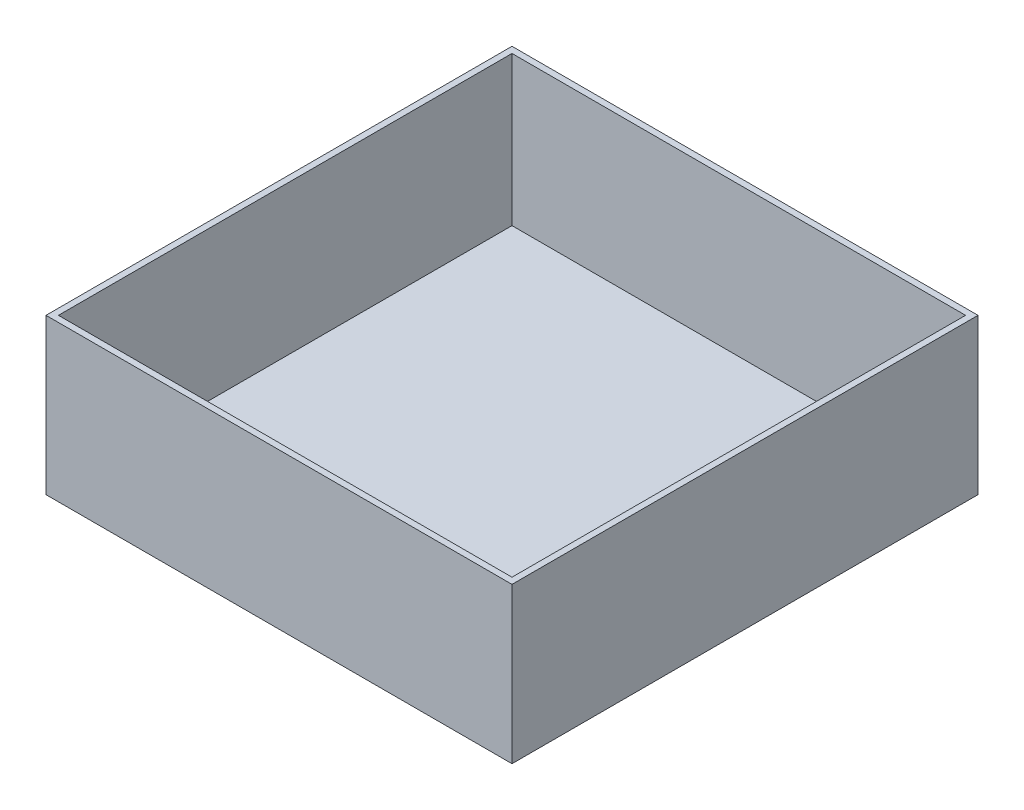
ISO-10303-21;
HEADER;
FILE_DESCRIPTION(('STEP AP214'),'2;1');
FILE_NAME('part.step','',(''),(''),'','','');
FILE_SCHEMA(('AUTOMOTIVE_DESIGN { 1 0 10303 214 1 1 1 1 }'));
ENDSEC;
DATA;
#1=APPLICATION_CONTEXT('core data for automotive mechanical design processes');
#2=APPLICATION_PROTOCOL_DEFINITION('international standard','automotive_design',2000,#1);
#3=PRODUCT_CONTEXT('',#1,'mechanical');
#4=PRODUCT('Part','Part','',(#3));
#5=PRODUCT_RELATED_PRODUCT_CATEGORY('part','',(#4));
#6=PRODUCT_DEFINITION_FORMATION('','',#4);
#7=PRODUCT_DEFINITION_CONTEXT('part definition',#1,'design');
#8=PRODUCT_DEFINITION('design','',#6,#7);
#9=PRODUCT_DEFINITION_SHAPE('','',#8);
#10=(LENGTH_UNIT() NAMED_UNIT(*) SI_UNIT(.MILLI.,.METRE.));
#11=(NAMED_UNIT(*) PLANE_ANGLE_UNIT() SI_UNIT($,.RADIAN.));
#12=(NAMED_UNIT(*) SI_UNIT($,.STERADIAN.) SOLID_ANGLE_UNIT());
#13=UNCERTAINTY_MEASURE_WITH_UNIT(LENGTH_MEASURE(1.E-05),#10,'distance_accuracy_value','');
#14=(GEOMETRIC_REPRESENTATION_CONTEXT(3) GLOBAL_UNCERTAINTY_ASSIGNED_CONTEXT((#13)) GLOBAL_UNIT_ASSIGNED_CONTEXT((#10,
#11,#12)) REPRESENTATION_CONTEXT('',''));
#15=CARTESIAN_POINT('',(0.,0.,0.));
#16=DIRECTION('',(0.,0.,1.));
#17=DIRECTION('',(1.,0.,0.));
#18=AXIS2_PLACEMENT_3D('',#15,#16,#17);
#19=CARTESIAN_POINT('',(-150.,50.,300.3));
#20=DIRECTION('',(0.,-1.,0.));
#21=DIRECTION('',(0.,0.,-1.));
#22=AXIS2_PLACEMENT_3D('',#19,#20,#21);
#23=PLANE('',#22);
#24=DIRECTION('',(-1.,0.,0.));
#25=VECTOR('',#24,1.);
#26=CARTESIAN_POINT('',(-150.,50.,0.3));
#27=LINE('',#26,#25);
#28=CARTESIAN_POINT('',(150.,50.,0.3));
#29=VERTEX_POINT('',#28);
#30=CARTESIAN_POINT('',(-150.,50.,0.3));
#31=VERTEX_POINT('',#30);
#32=EDGE_CURVE('E285',#29,#31,#27,.T.);
#33=ORIENTED_EDGE('',*,*,#32,.T.);
#34=DIRECTION('',(0.,0.,-1.));
#35=VECTOR('',#34,1.);
#36=CARTESIAN_POINT('',(-150.,50.,300.3));
#37=LINE('',#36,#35);
#38=CARTESIAN_POINT('',(-150.,50.,300.3));
#39=VERTEX_POINT('',#38);
#40=EDGE_CURVE('E295',#39,#31,#37,.T.);
#41=ORIENTED_EDGE('',*,*,#40,.F.);
#42=DIRECTION('',(-1.,0.,0.));
#43=VECTOR('',#42,1.);
#44=CARTESIAN_POINT('',(-150.,50.,300.3));
#45=LINE('',#44,#43);
#46=CARTESIAN_POINT('',(150.,50.,300.3));
#47=VERTEX_POINT('',#46);
#48=EDGE_CURVE('E275',#47,#39,#45,.T.);
#49=ORIENTED_EDGE('',*,*,#48,.F.);
#50=DIRECTION('',(0.,0.,-1.));
#51=VECTOR('',#50,1.);
#52=CARTESIAN_POINT('',(150.,50.,300.3));
#53=LINE('',#52,#51);
#54=EDGE_CURVE('E298',#47,#29,#53,.T.);
#55=ORIENTED_EDGE('',*,*,#54,.T.);
#56=EDGE_LOOP('',(#33,#41,#49,#55));
#57=FACE_BOUND('',#56,.T.);
#58=DIRECTION('',(-1.,0.,0.));
#59=VECTOR('',#58,1.);
#60=CARTESIAN_POINT('',(-150.,50.,4.30000000000003));
#61=LINE('',#60,#59);
#62=CARTESIAN_POINT('',(146.,50.,4.3));
#63=VERTEX_POINT('',#62);
#64=CARTESIAN_POINT('',(-146.,50.,4.3));
#65=VERTEX_POINT('',#64);
#66=EDGE_CURVE('E240',#63,#65,#61,.T.);
#67=ORIENTED_EDGE('',*,*,#66,.F.);
#68=DIRECTION('',(0.,0.,-1.));
#69=VECTOR('',#68,1.);
#70=CARTESIAN_POINT('',(146.,50.,300.3));
#71=LINE('',#70,#69);
#72=CARTESIAN_POINT('',(146.,50.,296.3));
#73=VERTEX_POINT('',#72);
#74=EDGE_CURVE('E265',#73,#63,#71,.T.);
#75=ORIENTED_EDGE('',*,*,#74,.F.);
#76=DIRECTION('',(-1.,0.,0.));
#77=VECTOR('',#76,1.);
#78=CARTESIAN_POINT('',(-150.,50.,296.3));
#79=LINE('',#78,#77);
#80=CARTESIAN_POINT('',(-146.,50.,296.3));
#81=VERTEX_POINT('',#80);
#82=EDGE_CURVE('E246',#73,#81,#79,.T.);
#83=ORIENTED_EDGE('',*,*,#82,.T.);
#84=DIRECTION('',(0.,0.,-1.));
#85=VECTOR('',#84,1.);
#86=CARTESIAN_POINT('',(-146.,50.,300.3));
#87=LINE('',#86,#85);
#88=EDGE_CURVE('E256',#81,#65,#87,.T.);
#89=ORIENTED_EDGE('',*,*,#88,.T.);
#90=EDGE_LOOP('',(#67,#75,#83,#89));
#91=FACE_BOUND('',#90,.T.);
#92=ADVANCED_FACE('F39',(#57,#91),#23,.F.);
#93=CARTESIAN_POINT('',(0.,-10.,-10.));
#94=DIRECTION('',(0.,1.,0.));
#95=DIRECTION('',(0.,0.,1.));
#96=AXIS2_PLACEMENT_3D('',#93,#94,#95);
#97=CYLINDRICAL_SURFACE('',#96,5.);
#98=DIRECTION('',(0.,1.,0.));
#99=VECTOR('',#98,1.);
#100=CARTESIAN_POINT('',(-5.,-10.,-10.));
#101=LINE('',#100,#99);
#102=CARTESIAN_POINT('',(-5.,-10.,-10.));
#103=VERTEX_POINT('',#102);
#104=CARTESIAN_POINT('',(-5.,-2.5,-10.));
#105=VERTEX_POINT('',#104);
#106=EDGE_CURVE('E364',#103,#105,#101,.T.);
#107=ORIENTED_EDGE('',*,*,#106,.T.);
#108=CARTESIAN_POINT('',(0.,-2.5,-10.));
#109=DIRECTION('',(0.,1.,0.));
#110=DIRECTION('',(0.,0.,1.));
#111=AXIS2_PLACEMENT_3D('',#108,#109,#110);
#112=CIRCLE('',#111,5.);
#113=CARTESIAN_POINT('',(5.,-2.5,-10.));
#114=VERTEX_POINT('',#113);
#115=EDGE_CURVE('E63',#105,#114,#112,.F.);
#116=ORIENTED_EDGE('',*,*,#115,.T.);
#117=DIRECTION('',(0.,1.,0.));
#118=VECTOR('',#117,1.);
#119=CARTESIAN_POINT('',(5.,-10.,-10.));
#120=LINE('',#119,#118);
#121=CARTESIAN_POINT('',(5.,-10.,-10.));
#122=VERTEX_POINT('',#121);
#123=EDGE_CURVE('E353',#122,#114,#120,.T.);
#124=ORIENTED_EDGE('',*,*,#123,.F.);
#125=CARTESIAN_POINT('',(0.,-10.,-10.));
#126=DIRECTION('',(0.,1.,0.));
#127=DIRECTION('',(0.,0.,1.));
#128=AXIS2_PLACEMENT_3D('',#125,#126,#127);
#129=CIRCLE('',#128,5.);
#130=EDGE_CURVE('E340',#122,#103,#129,.T.);
#131=ORIENTED_EDGE('',*,*,#130,.T.);
#132=EDGE_LOOP('',(#107,#116,#124,#131));
#133=FACE_BOUND('',#132,.T.);
#134=ADVANCED_FACE('F419',(#133),#97,.T.);
#135=CARTESIAN_POINT('',(0.,-10.,-10.));
#136=DIRECTION('',(0.,1.,0.));
#137=DIRECTION('',(0.,0.,1.));
#138=AXIS2_PLACEMENT_3D('',#135,#136,#137);
#139=CYLINDRICAL_SURFACE('',#138,2.5);
#140=CARTESIAN_POINT('',(0.,-10.,-10.));
#141=DIRECTION('',(0.,1.,0.));
#142=DIRECTION('',(0.,0.,1.));
#143=AXIS2_PLACEMENT_3D('',#140,#141,#142);
#144=CIRCLE('',#143,2.5);
#145=CARTESIAN_POINT('',(0.,-10.,-7.5));
#146=VERTEX_POINT('',#145);
#147=EDGE_CURVE('E337',#146,#146,#144,.T.);
#148=ORIENTED_EDGE('',*,*,#147,.F.);
#149=EDGE_LOOP('',(#148));
#150=FACE_BOUND('',#149,.T.);
#151=CARTESIAN_POINT('',(0.,-2.5,-10.));
#152=DIRECTION('',(0.,1.,0.));
#153=DIRECTION('',(0.,0.,1.));
#154=AXIS2_PLACEMENT_3D('',#151,#152,#153);
#155=CIRCLE('',#154,2.5);
#156=CARTESIAN_POINT('',(0.,-2.5,-7.5));
#157=VERTEX_POINT('',#156);
#158=EDGE_CURVE('E307',#157,#157,#155,.F.);
#159=ORIENTED_EDGE('',*,*,#158,.F.);
#160=EDGE_LOOP('',(#159));
#161=FACE_BOUND('',#160,.T.);
#162=ADVANCED_FACE('F425',(#150,#161),#139,.F.);
#163=CARTESIAN_POINT('',(0.,0.,0.));
#164=DIRECTION('',(0.,0.,1.));
#165=DIRECTION('',(1.,0.,0.));
#166=AXIS2_PLACEMENT_3D('',#163,#164,#165);
#167=PLANE('',#166);
#168=DIRECTION('',(0.,-1.,0.));
#169=VECTOR('',#168,1.);
#170=CARTESIAN_POINT('',(-20.,20.,0.));
#171=LINE('',#170,#169);
#172=CARTESIAN_POINT('',(-20.,20.,0.));
#173=VERTEX_POINT('',#172);
#174=CARTESIAN_POINT('',(-20.,-20.,0.));
#175=VERTEX_POINT('',#174);
#176=EDGE_CURVE('E356',#173,#175,#171,.T.);
#177=ORIENTED_EDGE('',*,*,#176,.F.);
#178=DIRECTION('',(1.,0.,0.));
#179=VECTOR('',#178,1.);
#180=CARTESIAN_POINT('',(-20.,20.,0.));
#181=LINE('',#180,#179);
#182=CARTESIAN_POINT('',(20.,20.,0.));
#183=VERTEX_POINT('',#182);
#184=EDGE_CURVE('E370',#173,#183,#181,.T.);
#185=ORIENTED_EDGE('',*,*,#184,.T.);
#186=DIRECTION('',(0.,-1.,0.));
#187=VECTOR('',#186,1.);
#188=CARTESIAN_POINT('',(20.,20.,0.));
#189=LINE('',#188,#187);
#190=CARTESIAN_POINT('',(20.,-20.,0.));
#191=VERTEX_POINT('',#190);
#192=EDGE_CURVE('E384',#183,#191,#189,.T.);
#193=ORIENTED_EDGE('',*,*,#192,.T.);
#194=DIRECTION('',(1.,0.,0.));
#195=VECTOR('',#194,1.);
#196=CARTESIAN_POINT('',(-20.,-20.,0.));
#197=LINE('',#196,#195);
#198=EDGE_CURVE('E381',#175,#191,#197,.T.);
#199=ORIENTED_EDGE('',*,*,#198,.F.);
#200=EDGE_LOOP('',(#177,#185,#193,#199));
#201=FACE_BOUND('',#200,.T.);
#202=DIRECTION('',(1.,0.,0.));
#203=VECTOR('',#202,1.);
#204=CARTESIAN_POINT('',(-5.,-10.,0.));
#205=LINE('',#204,#203);
#206=CARTESIAN_POINT('',(-5.,-10.,0.));
#207=VERTEX_POINT('',#206);
#208=CARTESIAN_POINT('',(5.,-10.,0.));
#209=VERTEX_POINT('',#208);
#210=EDGE_CURVE('E346',#207,#209,#205,.T.);
#211=ORIENTED_EDGE('',*,*,#210,.T.);
#212=DIRECTION('',(0.,1.,0.));
#213=VECTOR('',#212,1.);
#214=CARTESIAN_POINT('',(5.,-10.,0.));
#215=LINE('',#214,#213);
#216=CARTESIAN_POINT('',(5.,10.,0.));
#217=VERTEX_POINT('',#216);
#218=EDGE_CURVE('E358',#209,#217,#215,.T.);
#219=ORIENTED_EDGE('',*,*,#218,.T.);
#220=DIRECTION('',(1.,0.,0.));
#221=VECTOR('',#220,1.);
#222=CARTESIAN_POINT('',(-5.,10.,0.));
#223=LINE('',#222,#221);
#224=CARTESIAN_POINT('',(-5.,10.,0.));
#225=VERTEX_POINT('',#224);
#226=EDGE_CURVE('E332',#225,#217,#223,.T.);
#227=ORIENTED_EDGE('',*,*,#226,.F.);
#228=DIRECTION('',(0.,1.,0.));
#229=VECTOR('',#228,1.);
#230=CARTESIAN_POINT('',(-5.,-10.,0.));
#231=LINE('',#230,#229);
#232=EDGE_CURVE('E361',#207,#225,#231,.T.);
#233=ORIENTED_EDGE('',*,*,#232,.F.);
#234=EDGE_LOOP('',(#211,#219,#227,#233));
#235=FACE_BOUND('',#234,.T.);
#236=ADVANCED_FACE('F638',(#201,#235),#167,.F.);
#237=CARTESIAN_POINT('',(-20.,20.,0.3));
#238=DIRECTION('',(1.,0.,0.));
#239=DIRECTION('',(0.,1.,0.));
#240=AXIS2_PLACEMENT_3D('',#237,#238,#239);
#241=PLANE('',#240);
#242=ORIENTED_EDGE('',*,*,#176,.T.);
#243=DIRECTION('',(0.,0.,-1.));
#244=VECTOR('',#243,1.);
#245=CARTESIAN_POINT('',(-20.,-20.,0.3));
#246=LINE('',#245,#244);
#247=CARTESIAN_POINT('',(-20.,-20.,0.3));
#248=VERTEX_POINT('',#247);
#249=EDGE_CURVE('E48',#248,#175,#246,.T.);
#250=ORIENTED_EDGE('',*,*,#249,.F.);
#251=DIRECTION('',(0.,-1.,0.));
#252=VECTOR('',#251,1.);
#253=CARTESIAN_POINT('',(-20.,20.,0.3));
#254=LINE('',#253,#252);
#255=CARTESIAN_POINT('',(-20.,20.,0.3));
#256=VERTEX_POINT('',#255);
#257=EDGE_CURVE('E367',#256,#248,#254,.T.);
#258=ORIENTED_EDGE('',*,*,#257,.F.);
#259=DIRECTION('',(0.,0.,-1.));
#260=VECTOR('',#259,1.);
#261=CARTESIAN_POINT('',(-20.,20.,0.3));
#262=LINE('',#261,#260);
#263=EDGE_CURVE('E378',#256,#173,#262,.T.);
#264=ORIENTED_EDGE('',*,*,#263,.T.);
#265=EDGE_LOOP('',(#242,#250,#258,#264));
#266=FACE_BOUND('',#265,.T.);
#267=ADVANCED_FACE('F41',(#266),#241,.F.);
#268=CARTESIAN_POINT('',(-20.,-20.,0.3));
#269=DIRECTION('',(0.,1.,0.));
#270=DIRECTION('',(0.,0.,1.));
#271=AXIS2_PLACEMENT_3D('',#268,#269,#270);
#272=PLANE('',#271);
#273=ORIENTED_EDGE('',*,*,#198,.T.);
#274=DIRECTION('',(0.,0.,-1.));
#275=VECTOR('',#274,1.);
#276=CARTESIAN_POINT('',(20.,-20.,0.3));
#277=LINE('',#276,#275);
#278=CARTESIAN_POINT('',(20.,-20.,0.3));
#279=VERTEX_POINT('',#278);
#280=EDGE_CURVE('E392',#279,#191,#277,.T.);
#281=ORIENTED_EDGE('',*,*,#280,.F.);
#282=DIRECTION('',(1.,0.,0.));
#283=VECTOR('',#282,1.);
#284=CARTESIAN_POINT('',(-20.,-20.,0.3));
#285=LINE('',#284,#283);
#286=EDGE_CURVE('E369',#248,#279,#285,.T.);
#287=ORIENTED_EDGE('',*,*,#286,.F.);
#288=ORIENTED_EDGE('',*,*,#249,.T.);
#289=EDGE_LOOP('',(#273,#281,#287,#288));
#290=FACE_BOUND('',#289,.T.);
#291=ADVANCED_FACE('F620',(#290),#272,.F.);
#292=CARTESIAN_POINT('',(20.,20.,0.3));
#293=DIRECTION('',(1.,0.,0.));
#294=DIRECTION('',(0.,1.,0.));
#295=AXIS2_PLACEMENT_3D('',#292,#293,#294);
#296=PLANE('',#295);
#297=ORIENTED_EDGE('',*,*,#192,.F.);
#298=DIRECTION('',(0.,0.,-1.));
#299=VECTOR('',#298,1.);
#300=CARTESIAN_POINT('',(20.,20.,0.3));
#301=LINE('',#300,#299);
#302=CARTESIAN_POINT('',(20.,20.,0.3));
#303=VERTEX_POINT('',#302);
#304=EDGE_CURVE('E390',#303,#183,#301,.T.);
#305=ORIENTED_EDGE('',*,*,#304,.F.);
#306=DIRECTION('',(0.,-1.,0.));
#307=VECTOR('',#306,1.);
#308=CARTESIAN_POINT('',(20.,20.,0.3));
#309=LINE('',#308,#307);
#310=EDGE_CURVE('E372',#303,#279,#309,.T.);
#311=ORIENTED_EDGE('',*,*,#310,.T.);
#312=ORIENTED_EDGE('',*,*,#280,.T.);
#313=EDGE_LOOP('',(#297,#305,#311,#312));
#314=FACE_BOUND('',#313,.T.);
#315=ADVANCED_FACE('F608',(#314),#296,.T.);
#316=CARTESIAN_POINT('',(-20.,20.,0.3));
#317=DIRECTION('',(0.,1.,0.));
#318=DIRECTION('',(0.,0.,1.));
#319=AXIS2_PLACEMENT_3D('',#316,#317,#318);
#320=PLANE('',#319);
#321=ORIENTED_EDGE('',*,*,#184,.F.);
#322=ORIENTED_EDGE('',*,*,#263,.F.);
#323=DIRECTION('',(1.,0.,0.));
#324=VECTOR('',#323,1.);
#325=CARTESIAN_POINT('',(-20.,20.,0.3));
#326=LINE('',#325,#324);
#327=EDGE_CURVE('E375',#256,#303,#326,.T.);
#328=ORIENTED_EDGE('',*,*,#327,.T.);
#329=ORIENTED_EDGE('',*,*,#304,.T.);
#330=EDGE_LOOP('',(#321,#322,#328,#329));
#331=FACE_BOUND('',#330,.T.);
#332=ADVANCED_FACE('F603',(#331),#320,.T.);
#333=CARTESIAN_POINT('',(0.,2.5,-10.));
#334=DIRECTION('',(0.,1.,0.));
#335=DIRECTION('',(0.,0.,1.));
#336=AXIS2_PLACEMENT_3D('',#333,#334,#335);
#337=CIRCLE('',#336,5.);
#338=CARTESIAN_POINT('',(-5.,2.5,-10.));
#339=VERTEX_POINT('',#338);
#340=CARTESIAN_POINT('',(5.,2.5,-10.));
#341=VERTEX_POINT('',#340);
#342=EDGE_CURVE('E317',#339,#341,#337,.F.);
#343=ORIENTED_EDGE('',*,*,#342,.F.);
#344=CARTESIAN_POINT('',(-5.,10.,-10.));
#345=VERTEX_POINT('',#344);
#346=EDGE_CURVE('E352',#339,#345,#101,.T.);
#347=ORIENTED_EDGE('',*,*,#346,.T.);
#348=CARTESIAN_POINT('',(0.,10.,-10.));
#349=DIRECTION('',(0.,1.,0.));
#350=DIRECTION('',(0.,0.,1.));
#351=AXIS2_PLACEMENT_3D('',#348,#349,#350);
#352=CIRCLE('',#351,5.);
#353=CARTESIAN_POINT('',(5.,10.,-10.));
#354=VERTEX_POINT('',#353);
#355=EDGE_CURVE('E327',#354,#345,#352,.T.);
#356=ORIENTED_EDGE('',*,*,#355,.F.);
#357=EDGE_CURVE('E357',#341,#354,#120,.T.);
#358=ORIENTED_EDGE('',*,*,#357,.F.);
#359=EDGE_LOOP('',(#343,#347,#356,#358));
#360=FACE_BOUND('',#359,.T.);
#361=ADVANCED_FACE('F428',(#360),#97,.T.);
#362=CARTESIAN_POINT('',(5.,-10.,-10.));
#363=DIRECTION('',(1.,0.,0.));
#364=DIRECTION('',(0.,0.,-1.));
#365=AXIS2_PLACEMENT_3D('',#362,#363,#364);
#366=PLANE('',#365);
#367=DIRECTION('',(0.,0.,1.));
#368=VECTOR('',#367,1.);
#369=CARTESIAN_POINT('',(5.,2.5,-10.));
#370=LINE('',#369,#368);
#371=CARTESIAN_POINT('',(5.,2.5,-4.));
#372=VERTEX_POINT('',#371);
#373=EDGE_CURVE('E319',#341,#372,#370,.T.);
#374=ORIENTED_EDGE('',*,*,#373,.F.);
#375=ORIENTED_EDGE('',*,*,#357,.T.);
#376=DIRECTION('',(0.,0.,-1.));
#377=VECTOR('',#376,1.);
#378=CARTESIAN_POINT('',(5.,10.,-10.));
#379=LINE('',#378,#377);
#380=EDGE_CURVE('E334',#217,#354,#379,.T.);
#381=ORIENTED_EDGE('',*,*,#380,.F.);
#382=ORIENTED_EDGE('',*,*,#218,.F.);
#383=DIRECTION('',(0.,0.,-1.));
#384=VECTOR('',#383,1.);
#385=CARTESIAN_POINT('',(5.,-10.,-10.));
#386=LINE('',#385,#384);
#387=EDGE_CURVE('E349',#209,#122,#386,.T.);
#388=ORIENTED_EDGE('',*,*,#387,.T.);
#389=ORIENTED_EDGE('',*,*,#123,.T.);
#390=DIRECTION('',(0.,0.,1.));
#391=VECTOR('',#390,1.);
#392=CARTESIAN_POINT('',(5.,-2.5,-10.));
#393=LINE('',#392,#391);
#394=CARTESIAN_POINT('',(5.,-2.5,-4.));
#395=VERTEX_POINT('',#394);
#396=EDGE_CURVE('E311',#114,#395,#393,.T.);
#397=ORIENTED_EDGE('',*,*,#396,.T.);
#398=DIRECTION('',(0.,1.,0.));
#399=VECTOR('',#398,1.);
#400=CARTESIAN_POINT('',(5.,-10.,-4.));
#401=LINE('',#400,#399);
#402=EDGE_CURVE('E321',#395,#372,#401,.T.);
#403=ORIENTED_EDGE('',*,*,#402,.T.);
#404=EDGE_LOOP('',(#374,#375,#381,#382,#388,#389,#397,#403));
#405=FACE_BOUND('',#404,.T.);
#406=ADVANCED_FACE('F678',(#405),#366,.T.);
#407=CARTESIAN_POINT('',(-5.,-10.,-10.));
#408=DIRECTION('',(-1.,0.,0.));
#409=DIRECTION('',(0.,0.,1.));
#410=AXIS2_PLACEMENT_3D('',#407,#408,#409);
#411=PLANE('',#410);
#412=DIRECTION('',(0.,0.,-1.));
#413=VECTOR('',#412,1.);
#414=CARTESIAN_POINT('',(-5.,2.5,-10.));
#415=LINE('',#414,#413);
#416=CARTESIAN_POINT('',(-5.,2.5,-4.));
#417=VERTEX_POINT('',#416);
#418=EDGE_CURVE('E315',#417,#339,#415,.T.);
#419=ORIENTED_EDGE('',*,*,#418,.F.);
#420=DIRECTION('',(0.,-1.,0.));
#421=VECTOR('',#420,1.);
#422=CARTESIAN_POINT('',(-5.,-10.,-4.));
#423=LINE('',#422,#421);
#424=CARTESIAN_POINT('',(-5.,-2.5,-4.));
#425=VERTEX_POINT('',#424);
#426=EDGE_CURVE('E11',#417,#425,#423,.T.);
#427=ORIENTED_EDGE('',*,*,#426,.T.);
#428=DIRECTION('',(0.,0.,-1.));
#429=VECTOR('',#428,1.);
#430=CARTESIAN_POINT('',(-5.,-2.5,-10.));
#431=LINE('',#430,#429);
#432=EDGE_CURVE('E308',#425,#105,#431,.T.);
#433=ORIENTED_EDGE('',*,*,#432,.T.);
#434=ORIENTED_EDGE('',*,*,#106,.F.);
#435=DIRECTION('',(0.,0.,1.));
#436=VECTOR('',#435,1.);
#437=CARTESIAN_POINT('',(-5.,-10.,-10.));
#438=LINE('',#437,#436);
#439=EDGE_CURVE('E343',#103,#207,#438,.T.);
#440=ORIENTED_EDGE('',*,*,#439,.T.);
#441=ORIENTED_EDGE('',*,*,#232,.T.);
#442=DIRECTION('',(0.,0.,1.));
#443=VECTOR('',#442,1.);
#444=CARTESIAN_POINT('',(-5.,10.,-10.));
#445=LINE('',#444,#443);
#446=EDGE_CURVE('E330',#345,#225,#445,.T.);
#447=ORIENTED_EDGE('',*,*,#446,.F.);
#448=ORIENTED_EDGE('',*,*,#346,.F.);
#449=EDGE_LOOP('',(#419,#427,#433,#434,#440,#441,#447,#448));
#450=FACE_BOUND('',#449,.T.);
#451=ADVANCED_FACE('F673',(#450),#411,.T.);
#452=CARTESIAN_POINT('',(0.,-10.,-10.));
#453=DIRECTION('',(0.,1.,0.));
#454=DIRECTION('',(0.,0.,1.));
#455=AXIS2_PLACEMENT_3D('',#452,#453,#454);
#456=PLANE('',#455);
#457=ORIENTED_EDGE('',*,*,#147,.T.);
#458=EDGE_LOOP('',(#457));
#459=FACE_BOUND('',#458,.T.);
#460=ORIENTED_EDGE('',*,*,#130,.F.);
#461=ORIENTED_EDGE('',*,*,#387,.F.);
#462=ORIENTED_EDGE('',*,*,#210,.F.);
#463=ORIENTED_EDGE('',*,*,#439,.F.);
#464=EDGE_LOOP('',(#460,#461,#462,#463));
#465=FACE_BOUND('',#464,.T.);
#466=ADVANCED_FACE('F665',(#459,#465),#456,.F.);
#467=CARTESIAN_POINT('',(0.,2.5,-10.));
#468=DIRECTION('',(0.,1.,0.));
#469=DIRECTION('',(0.,0.,1.));
#470=AXIS2_PLACEMENT_3D('',#467,#468,#469);
#471=CIRCLE('',#470,2.5);
#472=CARTESIAN_POINT('',(0.,2.5,-7.5));
#473=VERTEX_POINT('',#472);
#474=EDGE_CURVE('E314',#473,#473,#471,.F.);
#475=ORIENTED_EDGE('',*,*,#474,.T.);
#476=EDGE_LOOP('',(#475));
#477=FACE_BOUND('',#476,.T.);
#478=CARTESIAN_POINT('',(0.,10.,-10.));
#479=DIRECTION('',(0.,1.,0.));
#480=DIRECTION('',(0.,0.,1.));
#481=AXIS2_PLACEMENT_3D('',#478,#479,#480);
#482=CIRCLE('',#481,2.5);
#483=CARTESIAN_POINT('',(0.,10.,-7.5));
#484=VERTEX_POINT('',#483);
#485=EDGE_CURVE('E324',#484,#484,#482,.T.);
#486=ORIENTED_EDGE('',*,*,#485,.T.);
#487=EDGE_LOOP('',(#486));
#488=FACE_BOUND('',#487,.T.);
#489=ADVANCED_FACE('F400',(#477,#488),#139,.F.);
#490=CARTESIAN_POINT('',(0.,10.,-10.));
#491=DIRECTION('',(0.,1.,0.));
#492=DIRECTION('',(0.,0.,1.));
#493=AXIS2_PLACEMENT_3D('',#490,#491,#492);
#494=PLANE('',#493);
#495=ORIENTED_EDGE('',*,*,#355,.T.);
#496=ORIENTED_EDGE('',*,*,#446,.T.);
#497=ORIENTED_EDGE('',*,*,#226,.T.);
#498=ORIENTED_EDGE('',*,*,#380,.T.);
#499=EDGE_LOOP('',(#495,#496,#497,#498));
#500=FACE_BOUND('',#499,.T.);
#501=ORIENTED_EDGE('',*,*,#485,.F.);
#502=EDGE_LOOP('',(#501));
#503=FACE_BOUND('',#502,.T.);
#504=ADVANCED_FACE('F406',(#500,#503),#494,.T.);
#505=CARTESIAN_POINT('',(0.,2.5,0.));
#506=DIRECTION('',(0.,1.,0.));
#507=DIRECTION('',(0.,0.,1.));
#508=AXIS2_PLACEMENT_3D('',#505,#506,#507);
#509=PLANE('',#508);
#510=ORIENTED_EDGE('',*,*,#373,.T.);
#511=DIRECTION('',(1.,0.,0.));
#512=VECTOR('',#511,1.);
#513=CARTESIAN_POINT('',(-7.02807757222276,2.5,-4.));
#514=LINE('',#513,#512);
#515=EDGE_CURVE('E304',#417,#372,#514,.T.);
#516=ORIENTED_EDGE('',*,*,#515,.F.);
#517=ORIENTED_EDGE('',*,*,#418,.T.);
#518=ORIENTED_EDGE('',*,*,#342,.T.);
#519=EDGE_LOOP('',(#510,#516,#517,#518));
#520=FACE_BOUND('',#519,.T.);
#521=ORIENTED_EDGE('',*,*,#474,.F.);
#522=EDGE_LOOP('',(#521));
#523=FACE_BOUND('',#522,.T.);
#524=ADVANCED_FACE('F403',(#520,#523),#509,.F.);
#525=CARTESIAN_POINT('',(0.,-2.5,0.));
#526=DIRECTION('',(0.,1.,0.));
#527=DIRECTION('',(0.,0.,1.));
#528=AXIS2_PLACEMENT_3D('',#525,#526,#527);
#529=PLANE('',#528);
#530=ORIENTED_EDGE('',*,*,#115,.F.);
#531=ORIENTED_EDGE('',*,*,#432,.F.);
#532=DIRECTION('',(1.,0.,0.));
#533=VECTOR('',#532,1.);
#534=CARTESIAN_POINT('',(-7.02807757222276,-2.5,-4.));
#535=LINE('',#534,#533);
#536=EDGE_CURVE('E301',#425,#395,#535,.T.);
#537=ORIENTED_EDGE('',*,*,#536,.T.);
#538=ORIENTED_EDGE('',*,*,#396,.F.);
#539=EDGE_LOOP('',(#530,#531,#537,#538));
#540=FACE_BOUND('',#539,.T.);
#541=ORIENTED_EDGE('',*,*,#158,.T.);
#542=EDGE_LOOP('',(#541));
#543=FACE_BOUND('',#542,.T.);
#544=ADVANCED_FACE('F405',(#540,#543),#529,.T.);
#545=CARTESIAN_POINT('',(-7.02807757222276,2.5,-4.));
#546=DIRECTION('',(0.,0.,-1.));
#547=DIRECTION('',(-1.,0.,0.));
#548=AXIS2_PLACEMENT_3D('',#545,#546,#547);
#549=PLANE('',#548);
#550=ORIENTED_EDGE('',*,*,#536,.F.);
#551=ORIENTED_EDGE('',*,*,#426,.F.);
#552=ORIENTED_EDGE('',*,*,#515,.T.);
#553=ORIENTED_EDGE('',*,*,#402,.F.);
#554=EDGE_LOOP('',(#550,#551,#552,#553));
#555=FACE_BOUND('',#554,.T.);
#556=ADVANCED_FACE('F413',(#555),#549,.T.);
#557=CARTESIAN_POINT('',(0.,0.,0.3));
#558=DIRECTION('',(0.,0.,1.));
#559=DIRECTION('',(1.,0.,0.));
#560=AXIS2_PLACEMENT_3D('',#557,#558,#559);
#561=PLANE('',#560);
#562=DIRECTION('',(0.,1.,0.));
#563=VECTOR('',#562,1.);
#564=CARTESIAN_POINT('',(150.,50.,0.3));
#565=LINE('',#564,#563);
#566=CARTESIAN_POINT('',(150.,-50.,0.3));
#567=VERTEX_POINT('',#566);
#568=EDGE_CURVE('E271',#567,#29,#565,.T.);
#569=ORIENTED_EDGE('',*,*,#568,.F.);
#570=DIRECTION('',(1.,0.,0.));
#571=VECTOR('',#570,1.);
#572=CARTESIAN_POINT('',(-150.,-50.,0.3));
#573=LINE('',#572,#571);
#574=CARTESIAN_POINT('',(-150.,-50.,0.3));
#575=VERTEX_POINT('',#574);
#576=EDGE_CURVE('E276',#575,#567,#573,.T.);
#577=ORIENTED_EDGE('',*,*,#576,.F.);
#578=DIRECTION('',(0.,-1.,0.));
#579=VECTOR('',#578,1.);
#580=CARTESIAN_POINT('',(-150.,50.,0.3));
#581=LINE('',#580,#579);
#582=EDGE_CURVE('E287',#31,#575,#581,.T.);
#583=ORIENTED_EDGE('',*,*,#582,.F.);
#584=ORIENTED_EDGE('',*,*,#32,.F.);
#585=EDGE_LOOP('',(#569,#577,#583,#584));
#586=FACE_BOUND('',#585,.T.);
#587=ORIENTED_EDGE('',*,*,#327,.F.);
#588=ORIENTED_EDGE('',*,*,#257,.T.);
#589=ORIENTED_EDGE('',*,*,#286,.T.);
#590=ORIENTED_EDGE('',*,*,#310,.F.);
#591=EDGE_LOOP('',(#587,#588,#589,#590));
#592=FACE_BOUND('',#591,.T.);
#593=ADVANCED_FACE('F436',(#586,#592),#561,.F.);
#594=CARTESIAN_POINT('',(150.,50.,300.3));
#595=DIRECTION('',(-1.,0.,0.));
#596=DIRECTION('',(0.,0.,1.));
#597=AXIS2_PLACEMENT_3D('',#594,#595,#596);
#598=PLANE('',#597);
#599=ORIENTED_EDGE('',*,*,#568,.T.);
#600=ORIENTED_EDGE('',*,*,#54,.F.);
#601=DIRECTION('',(0.,1.,0.));
#602=VECTOR('',#601,1.);
#603=CARTESIAN_POINT('',(150.,50.,300.3));
#604=LINE('',#603,#602);
#605=CARTESIAN_POINT('',(150.,-50.,300.3));
#606=VERTEX_POINT('',#605);
#607=EDGE_CURVE('E272',#606,#47,#604,.T.);
#608=ORIENTED_EDGE('',*,*,#607,.F.);
#609=DIRECTION('',(0.,0.,-1.));
#610=VECTOR('',#609,1.);
#611=CARTESIAN_POINT('',(150.,-50.,300.3));
#612=LINE('',#611,#610);
#613=EDGE_CURVE('E282',#606,#567,#612,.T.);
#614=ORIENTED_EDGE('',*,*,#613,.T.);
#615=EDGE_LOOP('',(#599,#600,#608,#614));
#616=FACE_BOUND('',#615,.T.);
#617=ADVANCED_FACE('F434',(#616),#598,.F.);
#618=CARTESIAN_POINT('',(-150.,50.,300.3));
#619=DIRECTION('',(1.,0.,0.));
#620=DIRECTION('',(0.,0.,-1.));
#621=AXIS2_PLACEMENT_3D('',#618,#619,#620);
#622=PLANE('',#621);
#623=ORIENTED_EDGE('',*,*,#582,.T.);
#624=DIRECTION('',(0.,0.,-1.));
#625=VECTOR('',#624,1.);
#626=CARTESIAN_POINT('',(-150.,-50.,300.3));
#627=LINE('',#626,#625);
#628=CARTESIAN_POINT('',(-150.,-50.,300.3));
#629=VERTEX_POINT('',#628);
#630=EDGE_CURVE('E292',#629,#575,#627,.T.);
#631=ORIENTED_EDGE('',*,*,#630,.F.);
#632=DIRECTION('',(0.,-1.,0.));
#633=VECTOR('',#632,1.);
#634=CARTESIAN_POINT('',(-150.,50.,300.3));
#635=LINE('',#634,#633);
#636=EDGE_CURVE('E278',#39,#629,#635,.T.);
#637=ORIENTED_EDGE('',*,*,#636,.F.);
#638=ORIENTED_EDGE('',*,*,#40,.T.);
#639=EDGE_LOOP('',(#623,#631,#637,#638));
#640=FACE_BOUND('',#639,.T.);
#641=ADVANCED_FACE('F432',(#640),#622,.F.);
#642=CARTESIAN_POINT('',(-150.,-50.,300.3));
#643=DIRECTION('',(0.,1.,0.));
#644=DIRECTION('',(0.,0.,1.));
#645=AXIS2_PLACEMENT_3D('',#642,#643,#644);
#646=PLANE('',#645);
#647=ORIENTED_EDGE('',*,*,#576,.T.);
#648=ORIENTED_EDGE('',*,*,#613,.F.);
#649=DIRECTION('',(1.,0.,0.));
#650=VECTOR('',#649,1.);
#651=CARTESIAN_POINT('',(-150.,-50.,300.3));
#652=LINE('',#651,#650);
#653=EDGE_CURVE('E280',#629,#606,#652,.T.);
#654=ORIENTED_EDGE('',*,*,#653,.F.);
#655=ORIENTED_EDGE('',*,*,#630,.T.);
#656=EDGE_LOOP('',(#647,#648,#654,#655));
#657=FACE_BOUND('',#656,.T.);
#658=ADVANCED_FACE('F442',(#657),#646,.F.);
#659=CARTESIAN_POINT('',(0.,0.,300.3));
#660=DIRECTION('',(0.,0.,1.));
#661=DIRECTION('',(1.,0.,0.));
#662=AXIS2_PLACEMENT_3D('',#659,#660,#661);
#663=PLANE('',#662);
#664=ORIENTED_EDGE('',*,*,#607,.T.);
#665=ORIENTED_EDGE('',*,*,#48,.T.);
#666=ORIENTED_EDGE('',*,*,#636,.T.);
#667=ORIENTED_EDGE('',*,*,#653,.T.);
#668=EDGE_LOOP('',(#664,#665,#666,#667));
#669=FACE_BOUND('',#668,.T.);
#670=ADVANCED_FACE('F456',(#669),#663,.T.);
#671=CARTESIAN_POINT('',(0.,0.,4.3));
#672=DIRECTION('',(0.,0.,1.));
#673=DIRECTION('',(1.,0.,0.));
#674=AXIS2_PLACEMENT_3D('',#671,#672,#673);
#675=PLANE('',#674);
#676=DIRECTION('',(0.,1.,0.));
#677=VECTOR('',#676,1.);
#678=CARTESIAN_POINT('',(146.,50.,4.30000000000003));
#679=LINE('',#678,#677);
#680=CARTESIAN_POINT('',(146.,-46.,4.3));
#681=VERTEX_POINT('',#680);
#682=EDGE_CURVE('E237',#681,#63,#679,.T.);
#683=ORIENTED_EDGE('',*,*,#682,.T.);
#684=ORIENTED_EDGE('',*,*,#66,.T.);
#685=DIRECTION('',(0.,-1.,0.));
#686=VECTOR('',#685,1.);
#687=CARTESIAN_POINT('',(-146.,50.,4.30000000000003));
#688=LINE('',#687,#686);
#689=CARTESIAN_POINT('',(-146.,-46.,4.3));
#690=VERTEX_POINT('',#689);
#691=EDGE_CURVE('E243',#65,#690,#688,.T.);
#692=ORIENTED_EDGE('',*,*,#691,.T.);
#693=DIRECTION('',(1.,0.,0.));
#694=VECTOR('',#693,1.);
#695=CARTESIAN_POINT('',(-150.,-46.,4.30000000000003));
#696=LINE('',#695,#694);
#697=EDGE_CURVE('E241',#690,#681,#696,.T.);
#698=ORIENTED_EDGE('',*,*,#697,.T.);
#699=EDGE_LOOP('',(#683,#684,#692,#698));
#700=FACE_BOUND('',#699,.T.);
#701=ADVANCED_FACE('F464',(#700),#675,.T.);
#702=CARTESIAN_POINT('',(146.,50.,300.3));
#703=DIRECTION('',(-1.,0.,0.));
#704=DIRECTION('',(0.,0.,1.));
#705=AXIS2_PLACEMENT_3D('',#702,#703,#704);
#706=PLANE('',#705);
#707=ORIENTED_EDGE('',*,*,#682,.F.);
#708=DIRECTION('',(0.,0.,-1.));
#709=VECTOR('',#708,1.);
#710=CARTESIAN_POINT('',(146.,-46.,300.3));
#711=LINE('',#710,#709);
#712=CARTESIAN_POINT('',(146.,-46.,296.3));
#713=VERTEX_POINT('',#712);
#714=EDGE_CURVE('E247',#713,#681,#711,.T.);
#715=ORIENTED_EDGE('',*,*,#714,.F.);
#716=DIRECTION('',(0.,1.,0.));
#717=VECTOR('',#716,1.);
#718=CARTESIAN_POINT('',(146.,50.,296.3));
#719=LINE('',#718,#717);
#720=EDGE_CURVE('E55',#713,#73,#719,.T.);
#721=ORIENTED_EDGE('',*,*,#720,.T.);
#722=ORIENTED_EDGE('',*,*,#74,.T.);
#723=EDGE_LOOP('',(#707,#715,#721,#722));
#724=FACE_BOUND('',#723,.T.);
#725=ADVANCED_FACE('F478',(#724),#706,.T.);
#726=CARTESIAN_POINT('',(-146.,50.,300.3));
#727=DIRECTION('',(1.,0.,0.));
#728=DIRECTION('',(0.,0.,-1.));
#729=AXIS2_PLACEMENT_3D('',#726,#727,#728);
#730=PLANE('',#729);
#731=ORIENTED_EDGE('',*,*,#691,.F.);
#732=ORIENTED_EDGE('',*,*,#88,.F.);
#733=DIRECTION('',(0.,-1.,0.));
#734=VECTOR('',#733,1.);
#735=CARTESIAN_POINT('',(-146.,50.,296.3));
#736=LINE('',#735,#734);
#737=CARTESIAN_POINT('',(-146.,-46.,296.3));
#738=VERTEX_POINT('',#737);
#739=EDGE_CURVE('E253',#81,#738,#736,.T.);
#740=ORIENTED_EDGE('',*,*,#739,.T.);
#741=DIRECTION('',(0.,0.,-1.));
#742=VECTOR('',#741,1.);
#743=CARTESIAN_POINT('',(-146.,-46.,300.3));
#744=LINE('',#743,#742);
#745=EDGE_CURVE('E250',#738,#690,#744,.T.);
#746=ORIENTED_EDGE('',*,*,#745,.T.);
#747=EDGE_LOOP('',(#731,#732,#740,#746));
#748=FACE_BOUND('',#747,.T.);
#749=ADVANCED_FACE('F474',(#748),#730,.T.);
#750=CARTESIAN_POINT('',(-150.,-46.,300.3));
#751=DIRECTION('',(0.,1.,0.));
#752=DIRECTION('',(0.,0.,1.));
#753=AXIS2_PLACEMENT_3D('',#750,#751,#752);
#754=PLANE('',#753);
#755=ORIENTED_EDGE('',*,*,#697,.F.);
#756=ORIENTED_EDGE('',*,*,#745,.F.);
#757=DIRECTION('',(1.,0.,0.));
#758=VECTOR('',#757,1.);
#759=CARTESIAN_POINT('',(-150.,-46.,296.3));
#760=LINE('',#759,#758);
#761=EDGE_CURVE('E251',#738,#713,#760,.T.);
#762=ORIENTED_EDGE('',*,*,#761,.T.);
#763=ORIENTED_EDGE('',*,*,#714,.T.);
#764=EDGE_LOOP('',(#755,#756,#762,#763));
#765=FACE_BOUND('',#764,.T.);
#766=ADVANCED_FACE('F470',(#765),#754,.T.);
#767=CARTESIAN_POINT('',(0.,0.,296.3));
#768=DIRECTION('',(0.,0.,1.));
#769=DIRECTION('',(1.,0.,0.));
#770=AXIS2_PLACEMENT_3D('',#767,#768,#769);
#771=PLANE('',#770);
#772=ORIENTED_EDGE('',*,*,#720,.F.);
#773=ORIENTED_EDGE('',*,*,#761,.F.);
#774=ORIENTED_EDGE('',*,*,#739,.F.);
#775=ORIENTED_EDGE('',*,*,#82,.F.);
#776=EDGE_LOOP('',(#772,#773,#774,#775));
#777=FACE_BOUND('',#776,.T.);
#778=ADVANCED_FACE('F467',(#777),#771,.F.);
#779=CLOSED_SHELL('',(#92,#134,#162,#236,#267,#291,#315,#332,#361,#406,#451,#466,#489,#504,#524,
#544,#556,#593,#617,#641,#658,#670,#701,#725,#749,#766,#778));
#780=CARTESIAN_POINT('',(0.,0.,4.));
#781=DIRECTION('',(0.,0.,-1.));
#782=DIRECTION('',(-1.,0.,0.));
#783=AXIS2_PLACEMENT_3D('',#780,#781,#782);
#784=PLANE('',#783);
#785=DIRECTION('',(0.,1.,0.));
#786=VECTOR('',#785,1.);
#787=CARTESIAN_POINT('',(1.,0.,4.));
#788=LINE('',#787,#786);
#789=CARTESIAN_POINT('',(1.,-6.,4.));
#790=VERTEX_POINT('',#789);
#791=CARTESIAN_POINT('',(1.,6.,4.));
#792=VERTEX_POINT('',#791);
#793=EDGE_CURVE('E202',#790,#792,#788,.T.);
#794=ORIENTED_EDGE('',*,*,#793,.F.);
#795=DIRECTION('',(1.,0.,0.));
#796=VECTOR('',#795,1.);
#797=CARTESIAN_POINT('',(0.,-6.,4.));
#798=LINE('',#797,#796);
#799=CARTESIAN_POINT('',(-1.,-6.,4.));
#800=VERTEX_POINT('',#799);
#801=EDGE_CURVE('E234',#800,#790,#798,.T.);
#802=ORIENTED_EDGE('',*,*,#801,.F.);
#803=DIRECTION('',(0.,1.,0.));
#804=VECTOR('',#803,1.);
#805=CARTESIAN_POINT('',(-1.,-10.,4.));
#806=LINE('',#805,#804);
#807=CARTESIAN_POINT('',(-1.,6.,4.));
#808=VERTEX_POINT('',#807);
#809=EDGE_CURVE('E215',#800,#808,#806,.T.);
#810=ORIENTED_EDGE('',*,*,#809,.T.);
#811=DIRECTION('',(1.,0.,0.));
#812=VECTOR('',#811,1.);
#813=CARTESIAN_POINT('',(0.,6.,4.));
#814=LINE('',#813,#812);
#815=EDGE_CURVE('E221',#808,#792,#814,.T.);
#816=ORIENTED_EDGE('',*,*,#815,.T.);
#817=EDGE_LOOP('',(#794,#802,#810,#816));
#818=FACE_BOUND('',#817,.T.);
#819=ADVANCED_FACE('F226',(#818),#784,.T.);
#820=CARTESIAN_POINT('',(-7.02807757222276,2.5,0.));
#821=DIRECTION('',(0.,0.,-1.));
#822=DIRECTION('',(-1.,0.,0.));
#823=AXIS2_PLACEMENT_3D('',#820,#821,#822);
#824=PLANE('',#823);
#825=DIRECTION('',(0.,-1.,0.));
#826=VECTOR('',#825,1.);
#827=CARTESIAN_POINT('',(-1.,-10.,0.));
#828=LINE('',#827,#826);
#829=CARTESIAN_POINT('',(-1.,6.,0.));
#830=VERTEX_POINT('',#829);
#831=CARTESIAN_POINT('',(-1.,-6.,0.));
#832=VERTEX_POINT('',#831);
#833=EDGE_CURVE('E214',#830,#832,#828,.T.);
#834=ORIENTED_EDGE('',*,*,#833,.T.);
#835=DIRECTION('',(-1.,0.,0.));
#836=VECTOR('',#835,1.);
#837=CARTESIAN_POINT('',(0.,-6.,0.));
#838=LINE('',#837,#836);
#839=CARTESIAN_POINT('',(1.,-6.,0.));
#840=VERTEX_POINT('',#839);
#841=EDGE_CURVE('E260',#840,#832,#838,.T.);
#842=ORIENTED_EDGE('',*,*,#841,.F.);
#843=DIRECTION('',(0.,1.,0.));
#844=VECTOR('',#843,1.);
#845=CARTESIAN_POINT('',(1.,-10.,0.));
#846=LINE('',#845,#844);
#847=CARTESIAN_POINT('',(1.,6.,0.));
#848=VERTEX_POINT('',#847);
#849=EDGE_CURVE('E230',#840,#848,#846,.T.);
#850=ORIENTED_EDGE('',*,*,#849,.T.);
#851=DIRECTION('',(1.,0.,0.));
#852=VECTOR('',#851,1.);
#853=CARTESIAN_POINT('',(-7.02807757222276,6.,0.));
#854=LINE('',#853,#852);
#855=EDGE_CURVE('E223',#830,#848,#854,.T.);
#856=ORIENTED_EDGE('',*,*,#855,.F.);
#857=EDGE_LOOP('',(#834,#842,#850,#856));
#858=FACE_BOUND('',#857,.T.);
#859=ADVANCED_FACE('F485',(#858),#824,.F.);
#860=CARTESIAN_POINT('',(0.,-6.,-10.));
#861=DIRECTION('',(0.,1.,0.));
#862=DIRECTION('',(0.,0.,1.));
#863=AXIS2_PLACEMENT_3D('',#860,#861,#862);
#864=PLANE('',#863);
#865=ORIENTED_EDGE('',*,*,#841,.T.);
#866=DIRECTION('',(0.,0.,1.));
#867=VECTOR('',#866,1.);
#868=CARTESIAN_POINT('',(-1.,-6.,-10.));
#869=LINE('',#868,#867);
#870=EDGE_CURVE('E224',#832,#800,#869,.T.);
#871=ORIENTED_EDGE('',*,*,#870,.T.);
#872=ORIENTED_EDGE('',*,*,#801,.T.);
#873=DIRECTION('',(0.,0.,-1.));
#874=VECTOR('',#873,1.);
#875=CARTESIAN_POINT('',(1.,-6.,-10.));
#876=LINE('',#875,#874);
#877=EDGE_CURVE('E209',#790,#840,#876,.T.);
#878=ORIENTED_EDGE('',*,*,#877,.T.);
#879=EDGE_LOOP('',(#865,#871,#872,#878));
#880=FACE_BOUND('',#879,.T.);
#881=ADVANCED_FACE('F488',(#880),#864,.T.);
#882=CARTESIAN_POINT('',(0.,6.,-10.));
#883=DIRECTION('',(0.,1.,0.));
#884=DIRECTION('',(0.,0.,1.));
#885=AXIS2_PLACEMENT_3D('',#882,#883,#884);
#886=PLANE('',#885);
#887=ORIENTED_EDGE('',*,*,#855,.T.);
#888=DIRECTION('',(0.,0.,-1.));
#889=VECTOR('',#888,1.);
#890=CARTESIAN_POINT('',(1.,6.,-10.));
#891=LINE('',#890,#889);
#892=EDGE_CURVE('E206',#792,#848,#891,.T.);
#893=ORIENTED_EDGE('',*,*,#892,.F.);
#894=ORIENTED_EDGE('',*,*,#815,.F.);
#895=DIRECTION('',(0.,0.,1.));
#896=VECTOR('',#895,1.);
#897=CARTESIAN_POINT('',(-1.,6.,-10.));
#898=LINE('',#897,#896);
#899=EDGE_CURVE('E228',#830,#808,#898,.T.);
#900=ORIENTED_EDGE('',*,*,#899,.F.);
#901=EDGE_LOOP('',(#887,#893,#894,#900));
#902=FACE_BOUND('',#901,.T.);
#903=ADVANCED_FACE('F219',(#902),#886,.F.);
#904=CARTESIAN_POINT('',(-1.,-10.,-10.));
#905=DIRECTION('',(-1.,0.,0.));
#906=DIRECTION('',(0.,0.,1.));
#907=AXIS2_PLACEMENT_3D('',#904,#905,#906);
#908=PLANE('',#907);
#909=ORIENTED_EDGE('',*,*,#899,.T.);
#910=ORIENTED_EDGE('',*,*,#809,.F.);
#911=ORIENTED_EDGE('',*,*,#870,.F.);
#912=ORIENTED_EDGE('',*,*,#833,.F.);
#913=EDGE_LOOP('',(#909,#910,#911,#912));
#914=FACE_BOUND('',#913,.T.);
#915=ADVANCED_FACE('F493',(#914),#908,.F.);
#916=CARTESIAN_POINT('',(1.,-10.,-10.));
#917=DIRECTION('',(1.,0.,0.));
#918=DIRECTION('',(0.,0.,-1.));
#919=AXIS2_PLACEMENT_3D('',#916,#917,#918);
#920=PLANE('',#919);
#921=ORIENTED_EDGE('',*,*,#849,.F.);
#922=ORIENTED_EDGE('',*,*,#877,.F.);
#923=ORIENTED_EDGE('',*,*,#793,.T.);
#924=ORIENTED_EDGE('',*,*,#892,.T.);
#925=EDGE_LOOP('',(#921,#922,#923,#924));
#926=FACE_BOUND('',#925,.T.);
#927=ADVANCED_FACE('F205',(#926),#920,.F.);
#928=CLOSED_SHELL('',(#819,#859,#881,#903,#915,#927));
#929=ORIENTED_CLOSED_SHELL('',*,#928,.T.);
#930=BREP_WITH_VOIDS('B2',#779,(#929));
#931=ADVANCED_BREP_SHAPE_REPRESENTATION('',(#18,#930),#14);
#932=SHAPE_DEFINITION_REPRESENTATION(#9,#931);
ENDSEC;
END-ISO-10303-21;
